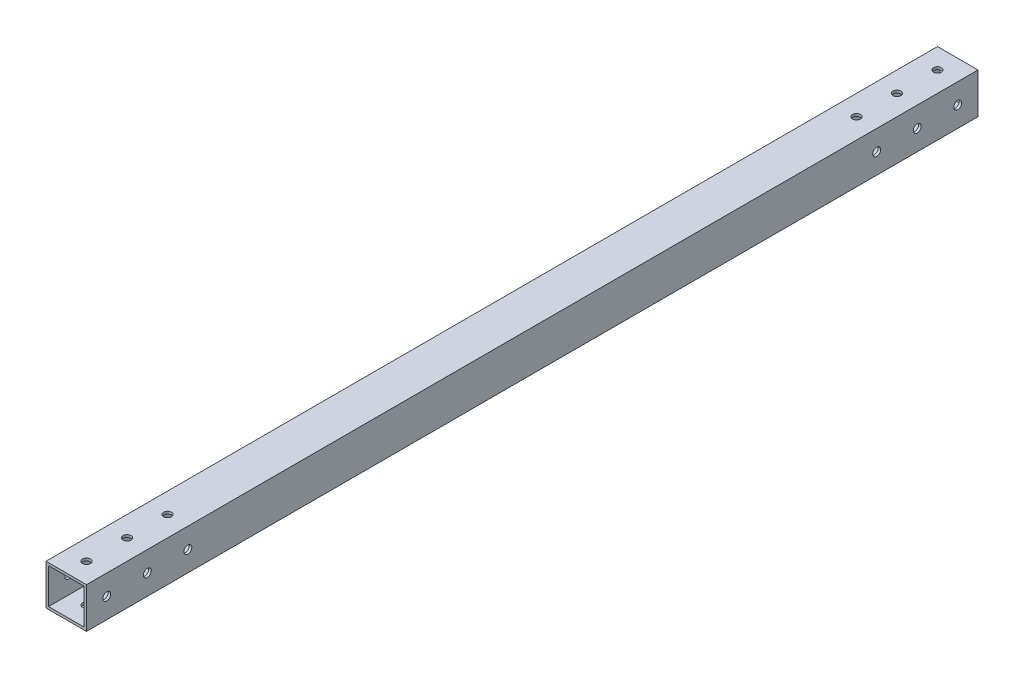
ISO-10303-21;
HEADER;
FILE_DESCRIPTION(('STEP AP214'),'2;1');
FILE_NAME('part.step','',(''),(''),'','','');
FILE_SCHEMA(('AUTOMOTIVE_DESIGN { 1 0 10303 214 1 1 1 1 }'));
ENDSEC;
DATA;
#1=APPLICATION_CONTEXT('core data for automotive mechanical design processes');
#2=APPLICATION_PROTOCOL_DEFINITION('international standard','automotive_design',2000,#1);
#3=PRODUCT_CONTEXT('',#1,'mechanical');
#4=PRODUCT('Part','Part','',(#3));
#5=PRODUCT_RELATED_PRODUCT_CATEGORY('part','',(#4));
#6=PRODUCT_DEFINITION_FORMATION('','',#4);
#7=PRODUCT_DEFINITION_CONTEXT('part definition',#1,'design');
#8=PRODUCT_DEFINITION('design','',#6,#7);
#9=PRODUCT_DEFINITION_SHAPE('','',#8);
#10=(LENGTH_UNIT() NAMED_UNIT(*) SI_UNIT(.MILLI.,.METRE.));
#11=(NAMED_UNIT(*) PLANE_ANGLE_UNIT() SI_UNIT($,.RADIAN.));
#12=(NAMED_UNIT(*) SI_UNIT($,.STERADIAN.) SOLID_ANGLE_UNIT());
#13=UNCERTAINTY_MEASURE_WITH_UNIT(LENGTH_MEASURE(1.E-05),#10,'distance_accuracy_value','');
#14=(GEOMETRIC_REPRESENTATION_CONTEXT(3) GLOBAL_UNCERTAINTY_ASSIGNED_CONTEXT((#13)) GLOBAL_UNIT_ASSIGNED_CONTEXT((#10,
#11,#12)) REPRESENTATION_CONTEXT('',''));
#15=CARTESIAN_POINT('',(0.,0.,0.));
#16=DIRECTION('',(0.,0.,1.));
#17=DIRECTION('',(1.,0.,0.));
#18=AXIS2_PLACEMENT_3D('',#15,#16,#17);
#19=CARTESIAN_POINT('',(0.,0.,279.4));
#20=DIRECTION('',(0.,0.,-1.));
#21=DIRECTION('',(-1.,0.,0.));
#22=AXIS2_PLACEMENT_3D('',#19,#20,#21);
#23=PLANE('',#22);
#24=DIRECTION('',(0.,-1.,0.));
#25=VECTOR('',#24,1.);
#26=CARTESIAN_POINT('',(0.,0.,279.4));
#27=LINE('',#26,#25);
#28=CARTESIAN_POINT('',(0.,25.4,279.4));
#29=VERTEX_POINT('',#28);
#30=CARTESIAN_POINT('',(0.,0.,279.4));
#31=VERTEX_POINT('',#30);
#32=EDGE_CURVE('E152',#29,#31,#27,.T.);
#33=ORIENTED_EDGE('',*,*,#32,.T.);
#34=DIRECTION('',(1.,0.,0.));
#35=VECTOR('',#34,1.);
#36=CARTESIAN_POINT('',(0.,0.,279.4));
#37=LINE('',#36,#35);
#38=CARTESIAN_POINT('',(25.4,0.,279.4));
#39=VERTEX_POINT('',#38);
#40=EDGE_CURVE('E156',#31,#39,#37,.T.);
#41=ORIENTED_EDGE('',*,*,#40,.T.);
#42=DIRECTION('',(0.,1.,0.));
#43=VECTOR('',#42,1.);
#44=CARTESIAN_POINT('',(25.4,0.,279.4));
#45=LINE('',#44,#43);
#46=CARTESIAN_POINT('',(25.4,25.4,279.4));
#47=VERTEX_POINT('',#46);
#48=EDGE_CURVE('E160',#39,#47,#45,.T.);
#49=ORIENTED_EDGE('',*,*,#48,.T.);
#50=DIRECTION('',(-1.,0.,0.));
#51=VECTOR('',#50,1.);
#52=CARTESIAN_POINT('',(0.,25.4,279.4));
#53=LINE('',#52,#51);
#54=EDGE_CURVE('E163',#47,#29,#53,.T.);
#55=ORIENTED_EDGE('',*,*,#54,.T.);
#56=EDGE_LOOP('',(#33,#41,#49,#55));
#57=FACE_BOUND('',#56,.T.);
#58=DIRECTION('',(0.,-1.,0.));
#59=VECTOR('',#58,1.);
#60=CARTESIAN_POINT('',(1.5875,0.,279.4));
#61=LINE('',#60,#59);
#62=CARTESIAN_POINT('',(1.58749999999999,23.8125,279.4));
#63=VERTEX_POINT('',#62);
#64=CARTESIAN_POINT('',(1.5875,1.5875,279.4));
#65=VERTEX_POINT('',#64);
#66=EDGE_CURVE('E133',#63,#65,#61,.T.);
#67=ORIENTED_EDGE('',*,*,#66,.F.);
#68=DIRECTION('',(-1.,0.,0.));
#69=VECTOR('',#68,1.);
#70=CARTESIAN_POINT('',(0.,23.8125,279.4));
#71=LINE('',#70,#69);
#72=CARTESIAN_POINT('',(23.8125,23.8125,279.4));
#73=VERTEX_POINT('',#72);
#74=EDGE_CURVE('E114',#73,#63,#71,.T.);
#75=ORIENTED_EDGE('',*,*,#74,.F.);
#76=DIRECTION('',(0.,1.,0.));
#77=VECTOR('',#76,1.);
#78=CARTESIAN_POINT('',(23.8125,0.,279.4));
#79=LINE('',#78,#77);
#80=CARTESIAN_POINT('',(23.8125,1.5875,279.4));
#81=VERTEX_POINT('',#80);
#82=EDGE_CURVE('E147',#81,#73,#79,.T.);
#83=ORIENTED_EDGE('',*,*,#82,.F.);
#84=DIRECTION('',(1.,0.,0.));
#85=VECTOR('',#84,1.);
#86=CARTESIAN_POINT('',(0.,1.5875,279.4));
#87=LINE('',#86,#85);
#88=EDGE_CURVE('E138',#65,#81,#87,.T.);
#89=ORIENTED_EDGE('',*,*,#88,.F.);
#90=EDGE_LOOP('',(#67,#75,#83,#89));
#91=FACE_BOUND('',#90,.T.);
#92=ADVANCED_FACE('F41',(#57,#91),#23,.F.);
#93=CARTESIAN_POINT('',(0.,0.,-279.4));
#94=DIRECTION('',(0.,0.,-1.));
#95=DIRECTION('',(-1.,0.,0.));
#96=AXIS2_PLACEMENT_3D('',#93,#94,#95);
#97=PLANE('',#96);
#98=DIRECTION('',(0.,-1.,0.));
#99=VECTOR('',#98,1.);
#100=CARTESIAN_POINT('',(0.,0.,-279.4));
#101=LINE('',#100,#99);
#102=CARTESIAN_POINT('',(0.,25.4,-279.4));
#103=VERTEX_POINT('',#102);
#104=CARTESIAN_POINT('',(0.,0.,-279.4));
#105=VERTEX_POINT('',#104);
#106=EDGE_CURVE('E167',#103,#105,#101,.T.);
#107=ORIENTED_EDGE('',*,*,#106,.F.);
#108=DIRECTION('',(-1.,0.,0.));
#109=VECTOR('',#108,1.);
#110=CARTESIAN_POINT('',(0.,25.4,-279.4));
#111=LINE('',#110,#109);
#112=CARTESIAN_POINT('',(25.4,25.4,-279.4));
#113=VERTEX_POINT('',#112);
#114=EDGE_CURVE('E157',#113,#103,#111,.T.);
#115=ORIENTED_EDGE('',*,*,#114,.F.);
#116=DIRECTION('',(0.,1.,0.));
#117=VECTOR('',#116,1.);
#118=CARTESIAN_POINT('',(25.4,0.,-279.4));
#119=LINE('',#118,#117);
#120=CARTESIAN_POINT('',(25.4,0.,-279.4));
#121=VERTEX_POINT('',#120);
#122=EDGE_CURVE('E174',#121,#113,#119,.T.);
#123=ORIENTED_EDGE('',*,*,#122,.F.);
#124=DIRECTION('',(1.,0.,0.));
#125=VECTOR('',#124,1.);
#126=CARTESIAN_POINT('',(0.,0.,-279.4));
#127=LINE('',#126,#125);
#128=EDGE_CURVE('E171',#105,#121,#127,.T.);
#129=ORIENTED_EDGE('',*,*,#128,.F.);
#130=EDGE_LOOP('',(#107,#115,#123,#129));
#131=FACE_BOUND('',#130,.T.);
#132=DIRECTION('',(-1.,0.,0.));
#133=VECTOR('',#132,1.);
#134=CARTESIAN_POINT('',(0.,23.8125,-279.4));
#135=LINE('',#134,#133);
#136=CARTESIAN_POINT('',(23.8125,23.8125,-279.4));
#137=VERTEX_POINT('',#136);
#138=CARTESIAN_POINT('',(1.58749999999999,23.8125,-279.4));
#139=VERTEX_POINT('',#138);
#140=EDGE_CURVE('E112',#137,#139,#135,.T.);
#141=ORIENTED_EDGE('',*,*,#140,.T.);
#142=DIRECTION('',(0.,-1.,0.));
#143=VECTOR('',#142,1.);
#144=CARTESIAN_POINT('',(1.5875,0.,-279.4));
#145=LINE('',#144,#143);
#146=CARTESIAN_POINT('',(1.5875,1.5875,-279.4));
#147=VERTEX_POINT('',#146);
#148=EDGE_CURVE('E121',#139,#147,#145,.T.);
#149=ORIENTED_EDGE('',*,*,#148,.T.);
#150=DIRECTION('',(1.,0.,0.));
#151=VECTOR('',#150,1.);
#152=CARTESIAN_POINT('',(0.,1.5875,-279.4));
#153=LINE('',#152,#151);
#154=CARTESIAN_POINT('',(23.8125,1.5875,-279.4));
#155=VERTEX_POINT('',#154);
#156=EDGE_CURVE('E128',#147,#155,#153,.T.);
#157=ORIENTED_EDGE('',*,*,#156,.T.);
#158=DIRECTION('',(0.,1.,0.));
#159=VECTOR('',#158,1.);
#160=CARTESIAN_POINT('',(23.8125,0.,-279.4));
#161=LINE('',#160,#159);
#162=EDGE_CURVE('E66',#155,#137,#161,.T.);
#163=ORIENTED_EDGE('',*,*,#162,.T.);
#164=EDGE_LOOP('',(#141,#149,#157,#163));
#165=FACE_BOUND('',#164,.T.);
#166=ADVANCED_FACE('F131',(#131,#165),#97,.T.);
#167=CARTESIAN_POINT('',(0.,0.,279.4));
#168=DIRECTION('',(1.,0.,0.));
#169=DIRECTION('',(0.,1.,0.));
#170=AXIS2_PLACEMENT_3D('',#167,#168,#169);
#171=PLANE('',#170);
#172=CARTESIAN_POINT('',(0.,12.7,-266.7));
#173=DIRECTION('',(1.,0.,0.));
#174=DIRECTION('',(0.,-1.,0.));
#175=AXIS2_PLACEMENT_3D('',#172,#173,#174);
#176=CIRCLE('',#175,2.48920000000001);
#177=CARTESIAN_POINT('',(0.,10.2108,-266.7));
#178=VERTEX_POINT('',#177);
#179=EDGE_CURVE('E850',#178,#178,#176,.T.);
#180=ORIENTED_EDGE('',*,*,#179,.T.);
#181=EDGE_LOOP('',(#180));
#182=FACE_BOUND('',#181,.T.);
#183=CARTESIAN_POINT('',(0.,12.7,-241.3));
#184=DIRECTION('',(1.,0.,0.));
#185=DIRECTION('',(0.,-1.,0.));
#186=AXIS2_PLACEMENT_3D('',#183,#184,#185);
#187=CIRCLE('',#186,2.4892);
#188=CARTESIAN_POINT('',(0.,10.2108,-241.3));
#189=VERTEX_POINT('',#188);
#190=EDGE_CURVE('E860',#189,#189,#187,.T.);
#191=ORIENTED_EDGE('',*,*,#190,.T.);
#192=EDGE_LOOP('',(#191));
#193=FACE_BOUND('',#192,.T.);
#194=CARTESIAN_POINT('',(0.,12.7,-215.9));
#195=DIRECTION('',(1.,0.,0.));
#196=DIRECTION('',(0.,-1.,0.));
#197=AXIS2_PLACEMENT_3D('',#194,#195,#196);
#198=CIRCLE('',#197,2.4892);
#199=CARTESIAN_POINT('',(0.,10.2108,-215.9));
#200=VERTEX_POINT('',#199);
#201=EDGE_CURVE('E258',#200,#200,#198,.T.);
#202=ORIENTED_EDGE('',*,*,#201,.T.);
#203=EDGE_LOOP('',(#202));
#204=FACE_BOUND('',#203,.T.);
#205=CARTESIAN_POINT('',(0.,12.7,266.7));
#206=DIRECTION('',(-1.,0.,0.));
#207=DIRECTION('',(0.,-1.,0.));
#208=AXIS2_PLACEMENT_3D('',#205,#206,#207);
#209=CIRCLE('',#208,2.48920000000001);
#210=CARTESIAN_POINT('',(0.,10.2108,266.7));
#211=VERTEX_POINT('',#210);
#212=EDGE_CURVE('E301',#211,#211,#209,.T.);
#213=ORIENTED_EDGE('',*,*,#212,.F.);
#214=EDGE_LOOP('',(#213));
#215=FACE_BOUND('',#214,.T.);
#216=CARTESIAN_POINT('',(0.,12.7,241.3));
#217=DIRECTION('',(-1.,0.,0.));
#218=DIRECTION('',(0.,-1.,0.));
#219=AXIS2_PLACEMENT_3D('',#216,#217,#218);
#220=CIRCLE('',#219,2.4892);
#221=CARTESIAN_POINT('',(0.,10.2108,241.3));
#222=VERTEX_POINT('',#221);
#223=EDGE_CURVE('E309',#222,#222,#220,.T.);
#224=ORIENTED_EDGE('',*,*,#223,.F.);
#225=EDGE_LOOP('',(#224));
#226=FACE_BOUND('',#225,.T.);
#227=CARTESIAN_POINT('',(0.,12.7,215.9));
#228=DIRECTION('',(-1.,0.,0.));
#229=DIRECTION('',(0.,-1.,0.));
#230=AXIS2_PLACEMENT_3D('',#227,#228,#229);
#231=CIRCLE('',#230,2.4892);
#232=CARTESIAN_POINT('',(0.,10.2108,215.9));
#233=VERTEX_POINT('',#232);
#234=EDGE_CURVE('E297',#233,#233,#231,.T.);
#235=ORIENTED_EDGE('',*,*,#234,.F.);
#236=EDGE_LOOP('',(#235));
#237=FACE_BOUND('',#236,.T.);
#238=ORIENTED_EDGE('',*,*,#106,.T.);
#239=DIRECTION('',(0.,0.,-1.));
#240=VECTOR('',#239,1.);
#241=CARTESIAN_POINT('',(0.,0.,279.4));
#242=LINE('',#241,#240);
#243=EDGE_CURVE('E11',#31,#105,#242,.T.);
#244=ORIENTED_EDGE('',*,*,#243,.F.);
#245=ORIENTED_EDGE('',*,*,#32,.F.);
#246=DIRECTION('',(0.,0.,-1.));
#247=VECTOR('',#246,1.);
#248=CARTESIAN_POINT('',(0.,25.4,279.4));
#249=LINE('',#248,#247);
#250=EDGE_CURVE('E166',#29,#103,#249,.T.);
#251=ORIENTED_EDGE('',*,*,#250,.T.);
#252=EDGE_LOOP('',(#238,#244,#245,#251));
#253=FACE_BOUND('',#252,.T.);
#254=ADVANCED_FACE('F43',(#182,#193,#204,#215,#226,#237,#253),#171,.F.);
#255=CARTESIAN_POINT('',(0.,0.,279.4));
#256=DIRECTION('',(0.,1.,0.));
#257=DIRECTION('',(0.,0.,1.));
#258=AXIS2_PLACEMENT_3D('',#255,#256,#257);
#259=PLANE('',#258);
#260=CARTESIAN_POINT('',(12.7,0.,-266.7));
#261=DIRECTION('',(0.,-1.,0.));
#262=DIRECTION('',(0.,0.,-1.));
#263=AXIS2_PLACEMENT_3D('',#260,#261,#262);
#264=CIRCLE('',#263,2.48920000000001);
#265=CARTESIAN_POINT('',(12.7,0.,-269.1892));
#266=VERTEX_POINT('',#265);
#267=EDGE_CURVE('E225',#266,#266,#264,.T.);
#268=ORIENTED_EDGE('',*,*,#267,.F.);
#269=EDGE_LOOP('',(#268));
#270=FACE_BOUND('',#269,.T.);
#271=CARTESIAN_POINT('',(12.7,0.,-241.3));
#272=DIRECTION('',(0.,-1.,0.));
#273=DIRECTION('',(0.,0.,-1.));
#274=AXIS2_PLACEMENT_3D('',#271,#272,#273);
#275=CIRCLE('',#274,2.48920000000001);
#276=CARTESIAN_POINT('',(12.7,0.,-243.7892));
#277=VERTEX_POINT('',#276);
#278=EDGE_CURVE('E273',#277,#277,#275,.T.);
#279=ORIENTED_EDGE('',*,*,#278,.F.);
#280=EDGE_LOOP('',(#279));
#281=FACE_BOUND('',#280,.T.);
#282=CARTESIAN_POINT('',(12.7,0.,-215.9));
#283=DIRECTION('',(0.,-1.,0.));
#284=DIRECTION('',(0.,0.,-1.));
#285=AXIS2_PLACEMENT_3D('',#282,#283,#284);
#286=CIRCLE('',#285,2.48920000000001);
#287=CARTESIAN_POINT('',(12.7,0.,-218.3892));
#288=VERTEX_POINT('',#287);
#289=EDGE_CURVE('E281',#288,#288,#286,.T.);
#290=ORIENTED_EDGE('',*,*,#289,.F.);
#291=EDGE_LOOP('',(#290));
#292=FACE_BOUND('',#291,.T.);
#293=CARTESIAN_POINT('',(12.7,0.,266.7));
#294=DIRECTION('',(0.,1.,0.));
#295=DIRECTION('',(0.,0.,1.));
#296=AXIS2_PLACEMENT_3D('',#293,#294,#295);
#297=CIRCLE('',#296,2.48920000000001);
#298=CARTESIAN_POINT('',(12.7,0.,269.1892));
#299=VERTEX_POINT('',#298);
#300=EDGE_CURVE('E194',#299,#299,#297,.T.);
#301=ORIENTED_EDGE('',*,*,#300,.T.);
#302=EDGE_LOOP('',(#301));
#303=FACE_BOUND('',#302,.T.);
#304=CARTESIAN_POINT('',(12.7,0.,241.3));
#305=DIRECTION('',(0.,1.,0.));
#306=DIRECTION('',(0.,0.,1.));
#307=AXIS2_PLACEMENT_3D('',#304,#305,#306);
#308=CIRCLE('',#307,2.48920000000001);
#309=CARTESIAN_POINT('',(12.7,0.,243.7892));
#310=VERTEX_POINT('',#309);
#311=EDGE_CURVE('E337',#310,#310,#308,.T.);
#312=ORIENTED_EDGE('',*,*,#311,.T.);
#313=EDGE_LOOP('',(#312));
#314=FACE_BOUND('',#313,.T.);
#315=CARTESIAN_POINT('',(12.7,0.,215.9));
#316=DIRECTION('',(0.,1.,0.));
#317=DIRECTION('',(0.,0.,1.));
#318=AXIS2_PLACEMENT_3D('',#315,#316,#317);
#319=CIRCLE('',#318,2.48920000000001);
#320=CARTESIAN_POINT('',(12.7,0.,218.3892));
#321=VERTEX_POINT('',#320);
#322=EDGE_CURVE('E345',#321,#321,#319,.T.);
#323=ORIENTED_EDGE('',*,*,#322,.T.);
#324=EDGE_LOOP('',(#323));
#325=FACE_BOUND('',#324,.T.);
#326=ORIENTED_EDGE('',*,*,#128,.T.);
#327=DIRECTION('',(0.,0.,-1.));
#328=VECTOR('',#327,1.);
#329=CARTESIAN_POINT('',(25.4,0.,279.4));
#330=LINE('',#329,#328);
#331=EDGE_CURVE('E51',#39,#121,#330,.T.);
#332=ORIENTED_EDGE('',*,*,#331,.F.);
#333=ORIENTED_EDGE('',*,*,#40,.F.);
#334=ORIENTED_EDGE('',*,*,#243,.T.);
#335=EDGE_LOOP('',(#326,#332,#333,#334));
#336=FACE_BOUND('',#335,.T.);
#337=ADVANCED_FACE('F401',(#270,#281,#292,#303,#314,#325,#336),#259,.F.);
#338=CARTESIAN_POINT('',(25.4,0.,279.4));
#339=DIRECTION('',(-1.,0.,0.));
#340=DIRECTION('',(0.,-1.,0.));
#341=AXIS2_PLACEMENT_3D('',#338,#339,#340);
#342=PLANE('',#341);
#343=CARTESIAN_POINT('',(25.4,12.7,-266.7));
#344=DIRECTION('',(1.,0.,0.));
#345=DIRECTION('',(0.,-1.,0.));
#346=AXIS2_PLACEMENT_3D('',#343,#344,#345);
#347=CIRCLE('',#346,2.48920000000001);
#348=CARTESIAN_POINT('',(25.4,10.2108,-266.7));
#349=VERTEX_POINT('',#348);
#350=EDGE_CURVE('E240',#349,#349,#347,.T.);
#351=ORIENTED_EDGE('',*,*,#350,.F.);
#352=EDGE_LOOP('',(#351));
#353=FACE_BOUND('',#352,.T.);
#354=CARTESIAN_POINT('',(25.4,12.7,-241.3));
#355=DIRECTION('',(1.,0.,0.));
#356=DIRECTION('',(0.,-1.,0.));
#357=AXIS2_PLACEMENT_3D('',#354,#355,#356);
#358=CIRCLE('',#357,2.4892);
#359=CARTESIAN_POINT('',(25.4,10.2108,-241.3));
#360=VERTEX_POINT('',#359);
#361=EDGE_CURVE('E852',#360,#360,#358,.T.);
#362=ORIENTED_EDGE('',*,*,#361,.F.);
#363=EDGE_LOOP('',(#362));
#364=FACE_BOUND('',#363,.T.);
#365=CARTESIAN_POINT('',(25.4,12.7,-215.9));
#366=DIRECTION('',(1.,0.,0.));
#367=DIRECTION('',(0.,-1.,0.));
#368=AXIS2_PLACEMENT_3D('',#365,#366,#367);
#369=CIRCLE('',#368,2.4892);
#370=CARTESIAN_POINT('',(25.4,10.2108,-215.9));
#371=VERTEX_POINT('',#370);
#372=EDGE_CURVE('E865',#371,#371,#369,.T.);
#373=ORIENTED_EDGE('',*,*,#372,.F.);
#374=EDGE_LOOP('',(#373));
#375=FACE_BOUND('',#374,.T.);
#376=CARTESIAN_POINT('',(25.4,12.7,266.7));
#377=DIRECTION('',(-1.,0.,0.));
#378=DIRECTION('',(0.,-1.,0.));
#379=AXIS2_PLACEMENT_3D('',#376,#377,#378);
#380=CIRCLE('',#379,2.48920000000001);
#381=CARTESIAN_POINT('',(25.4,10.2108,266.7));
#382=VERTEX_POINT('',#381);
#383=EDGE_CURVE('E209',#382,#382,#380,.T.);
#384=ORIENTED_EDGE('',*,*,#383,.T.);
#385=EDGE_LOOP('',(#384));
#386=FACE_BOUND('',#385,.T.);
#387=CARTESIAN_POINT('',(25.4,12.7,241.3));
#388=DIRECTION('',(-1.,0.,0.));
#389=DIRECTION('',(0.,-1.,0.));
#390=AXIS2_PLACEMENT_3D('',#387,#388,#389);
#391=CIRCLE('',#390,2.4892);
#392=CARTESIAN_POINT('',(25.4,10.2108,241.3));
#393=VERTEX_POINT('',#392);
#394=EDGE_CURVE('E305',#393,#393,#391,.T.);
#395=ORIENTED_EDGE('',*,*,#394,.T.);
#396=EDGE_LOOP('',(#395));
#397=FACE_BOUND('',#396,.T.);
#398=CARTESIAN_POINT('',(25.4,12.7,215.9));
#399=DIRECTION('',(-1.,0.,0.));
#400=DIRECTION('',(0.,-1.,0.));
#401=AXIS2_PLACEMENT_3D('',#398,#399,#400);
#402=CIRCLE('',#401,2.4892);
#403=CARTESIAN_POINT('',(25.4,10.2108,215.9));
#404=VERTEX_POINT('',#403);
#405=EDGE_CURVE('E313',#404,#404,#402,.T.);
#406=ORIENTED_EDGE('',*,*,#405,.T.);
#407=EDGE_LOOP('',(#406));
#408=FACE_BOUND('',#407,.T.);
#409=ORIENTED_EDGE('',*,*,#122,.T.);
#410=DIRECTION('',(0.,0.,-1.));
#411=VECTOR('',#410,1.);
#412=CARTESIAN_POINT('',(25.4,25.4,279.4));
#413=LINE('',#412,#411);
#414=EDGE_CURVE('E182',#47,#113,#413,.T.);
#415=ORIENTED_EDGE('',*,*,#414,.F.);
#416=ORIENTED_EDGE('',*,*,#48,.F.);
#417=ORIENTED_EDGE('',*,*,#331,.T.);
#418=EDGE_LOOP('',(#409,#415,#416,#417));
#419=FACE_BOUND('',#418,.T.);
#420=ADVANCED_FACE('F398',(#353,#364,#375,#386,#397,#408,#419),#342,.F.);
#421=CARTESIAN_POINT('',(0.,25.4,279.4));
#422=DIRECTION('',(0.,-1.,0.));
#423=DIRECTION('',(0.,0.,-1.));
#424=AXIS2_PLACEMENT_3D('',#421,#422,#423);
#425=PLANE('',#424);
#426=CARTESIAN_POINT('',(12.7,25.4,-266.7));
#427=DIRECTION('',(0.,-1.,0.));
#428=DIRECTION('',(0.,0.,-1.));
#429=AXIS2_PLACEMENT_3D('',#426,#427,#428);
#430=CIRCLE('',#429,2.48920000000001);
#431=CARTESIAN_POINT('',(12.7,25.4,-269.1892));
#432=VERTEX_POINT('',#431);
#433=EDGE_CURVE('E269',#432,#432,#430,.T.);
#434=ORIENTED_EDGE('',*,*,#433,.T.);
#435=EDGE_LOOP('',(#434));
#436=FACE_BOUND('',#435,.T.);
#437=CARTESIAN_POINT('',(12.7,25.4,-241.3));
#438=DIRECTION('',(0.,-1.,0.));
#439=DIRECTION('',(0.,0.,-1.));
#440=AXIS2_PLACEMENT_3D('',#437,#438,#439);
#441=CIRCLE('',#440,2.48920000000001);
#442=CARTESIAN_POINT('',(12.7,25.4,-243.7892));
#443=VERTEX_POINT('',#442);
#444=EDGE_CURVE('E277',#443,#443,#441,.T.);
#445=ORIENTED_EDGE('',*,*,#444,.T.);
#446=EDGE_LOOP('',(#445));
#447=FACE_BOUND('',#446,.T.);
#448=CARTESIAN_POINT('',(12.7,25.4,-215.9));
#449=DIRECTION('',(0.,-1.,0.));
#450=DIRECTION('',(0.,0.,-1.));
#451=AXIS2_PLACEMENT_3D('',#448,#449,#450);
#452=CIRCLE('',#451,2.48920000000001);
#453=CARTESIAN_POINT('',(12.7,25.4,-218.3892));
#454=VERTEX_POINT('',#453);
#455=EDGE_CURVE('E265',#454,#454,#452,.T.);
#456=ORIENTED_EDGE('',*,*,#455,.T.);
#457=EDGE_LOOP('',(#456));
#458=FACE_BOUND('',#457,.T.);
#459=CARTESIAN_POINT('',(12.7,25.4,266.7));
#460=DIRECTION('',(0.,1.,0.));
#461=DIRECTION('',(0.,0.,1.));
#462=AXIS2_PLACEMENT_3D('',#459,#460,#461);
#463=CIRCLE('',#462,2.48920000000001);
#464=CARTESIAN_POINT('',(12.7,25.4,269.1892));
#465=VERTEX_POINT('',#464);
#466=EDGE_CURVE('E333',#465,#465,#463,.T.);
#467=ORIENTED_EDGE('',*,*,#466,.F.);
#468=EDGE_LOOP('',(#467));
#469=FACE_BOUND('',#468,.T.);
#470=CARTESIAN_POINT('',(12.7,25.4,241.3));
#471=DIRECTION('',(0.,1.,0.));
#472=DIRECTION('',(0.,0.,1.));
#473=AXIS2_PLACEMENT_3D('',#470,#471,#472);
#474=CIRCLE('',#473,2.48920000000001);
#475=CARTESIAN_POINT('',(12.7,25.4,243.7892));
#476=VERTEX_POINT('',#475);
#477=EDGE_CURVE('E341',#476,#476,#474,.T.);
#478=ORIENTED_EDGE('',*,*,#477,.F.);
#479=EDGE_LOOP('',(#478));
#480=FACE_BOUND('',#479,.T.);
#481=CARTESIAN_POINT('',(12.7,25.4,215.9));
#482=DIRECTION('',(0.,1.,0.));
#483=DIRECTION('',(0.,0.,1.));
#484=AXIS2_PLACEMENT_3D('',#481,#482,#483);
#485=CIRCLE('',#484,2.48920000000001);
#486=CARTESIAN_POINT('',(12.7,25.4,218.3892));
#487=VERTEX_POINT('',#486);
#488=EDGE_CURVE('E329',#487,#487,#485,.T.);
#489=ORIENTED_EDGE('',*,*,#488,.F.);
#490=EDGE_LOOP('',(#489));
#491=FACE_BOUND('',#490,.T.);
#492=ORIENTED_EDGE('',*,*,#114,.T.);
#493=ORIENTED_EDGE('',*,*,#250,.F.);
#494=ORIENTED_EDGE('',*,*,#54,.F.);
#495=ORIENTED_EDGE('',*,*,#414,.T.);
#496=EDGE_LOOP('',(#492,#493,#494,#495));
#497=FACE_BOUND('',#496,.T.);
#498=ADVANCED_FACE('F382',(#436,#447,#458,#469,#480,#491,#497),#425,.F.);
#499=CARTESIAN_POINT('',(1.5875,0.,279.4));
#500=DIRECTION('',(1.,0.,0.));
#501=DIRECTION('',(0.,1.,0.));
#502=AXIS2_PLACEMENT_3D('',#499,#500,#501);
#503=PLANE('',#502);
#504=CARTESIAN_POINT('',(1.5875,12.7,-266.7));
#505=DIRECTION('',(1.,0.,0.));
#506=DIRECTION('',(0.,1.,0.));
#507=AXIS2_PLACEMENT_3D('',#504,#505,#506);
#508=CIRCLE('',#507,2.48920000000001);
#509=CARTESIAN_POINT('',(1.58749999999999,15.1892,-266.7));
#510=VERTEX_POINT('',#509);
#511=EDGE_CURVE('E261',#510,#510,#508,.F.);
#512=ORIENTED_EDGE('',*,*,#511,.T.);
#513=EDGE_LOOP('',(#512));
#514=FACE_BOUND('',#513,.T.);
#515=CARTESIAN_POINT('',(1.5875,12.7,-241.3));
#516=DIRECTION('',(1.,0.,0.));
#517=DIRECTION('',(0.,1.,0.));
#518=AXIS2_PLACEMENT_3D('',#515,#516,#517);
#519=CIRCLE('',#518,2.4892);
#520=CARTESIAN_POINT('',(1.58749999999999,15.1892,-241.3));
#521=VERTEX_POINT('',#520);
#522=EDGE_CURVE('E244',#521,#521,#519,.F.);
#523=ORIENTED_EDGE('',*,*,#522,.T.);
#524=EDGE_LOOP('',(#523));
#525=FACE_BOUND('',#524,.T.);
#526=CARTESIAN_POINT('',(1.5875,12.7,-215.9));
#527=DIRECTION('',(1.,0.,0.));
#528=DIRECTION('',(0.,1.,0.));
#529=AXIS2_PLACEMENT_3D('',#526,#527,#528);
#530=CIRCLE('',#529,2.4892);
#531=CARTESIAN_POINT('',(1.58749999999999,15.1892,-215.9));
#532=VERTEX_POINT('',#531);
#533=EDGE_CURVE('E239',#532,#532,#530,.F.);
#534=ORIENTED_EDGE('',*,*,#533,.T.);
#535=EDGE_LOOP('',(#534));
#536=FACE_BOUND('',#535,.T.);
#537=CARTESIAN_POINT('',(1.5875,12.7,266.7));
#538=DIRECTION('',(1.,0.,0.));
#539=DIRECTION('',(0.,1.,0.));
#540=AXIS2_PLACEMENT_3D('',#537,#538,#539);
#541=CIRCLE('',#540,2.48920000000001);
#542=CARTESIAN_POINT('',(1.58749999999999,15.1892,266.7));
#543=VERTEX_POINT('',#542);
#544=EDGE_CURVE('E219',#543,#543,#541,.T.);
#545=ORIENTED_EDGE('',*,*,#544,.F.);
#546=EDGE_LOOP('',(#545));
#547=FACE_BOUND('',#546,.T.);
#548=CARTESIAN_POINT('',(1.5875,12.7,241.3));
#549=DIRECTION('',(1.,0.,0.));
#550=DIRECTION('',(0.,1.,0.));
#551=AXIS2_PLACEMENT_3D('',#548,#549,#550);
#552=CIRCLE('',#551,2.4892);
#553=CARTESIAN_POINT('',(1.58749999999999,15.1892,241.3));
#554=VERTEX_POINT('',#553);
#555=EDGE_CURVE('E214',#554,#554,#552,.T.);
#556=ORIENTED_EDGE('',*,*,#555,.F.);
#557=EDGE_LOOP('',(#556));
#558=FACE_BOUND('',#557,.T.);
#559=CARTESIAN_POINT('',(1.5875,12.7,215.9));
#560=DIRECTION('',(1.,0.,0.));
#561=DIRECTION('',(0.,1.,0.));
#562=AXIS2_PLACEMENT_3D('',#559,#560,#561);
#563=CIRCLE('',#562,2.4892);
#564=CARTESIAN_POINT('',(1.58749999999999,15.1892,215.9));
#565=VERTEX_POINT('',#564);
#566=EDGE_CURVE('E208',#565,#565,#563,.T.);
#567=ORIENTED_EDGE('',*,*,#566,.F.);
#568=EDGE_LOOP('',(#567));
#569=FACE_BOUND('',#568,.T.);
#570=ORIENTED_EDGE('',*,*,#148,.F.);
#571=DIRECTION('',(0.,0.,-1.));
#572=VECTOR('',#571,1.);
#573=CARTESIAN_POINT('',(1.58749999999999,23.8125,279.4));
#574=LINE('',#573,#572);
#575=EDGE_CURVE('E108',#63,#139,#574,.T.);
#576=ORIENTED_EDGE('',*,*,#575,.F.);
#577=ORIENTED_EDGE('',*,*,#66,.T.);
#578=DIRECTION('',(0.,0.,-1.));
#579=VECTOR('',#578,1.);
#580=CARTESIAN_POINT('',(1.5875,1.5875,279.4));
#581=LINE('',#580,#579);
#582=EDGE_CURVE('E124',#65,#147,#581,.T.);
#583=ORIENTED_EDGE('',*,*,#582,.T.);
#584=EDGE_LOOP('',(#570,#576,#577,#583));
#585=FACE_BOUND('',#584,.T.);
#586=ADVANCED_FACE('F122',(#514,#525,#536,#547,#558,#569,#585),#503,.T.);
#587=CARTESIAN_POINT('',(0.,1.5875,279.4));
#588=DIRECTION('',(0.,1.,0.));
#589=DIRECTION('',(0.,0.,1.));
#590=AXIS2_PLACEMENT_3D('',#587,#588,#589);
#591=PLANE('',#590);
#592=CARTESIAN_POINT('',(12.7,1.5875,-266.7));
#593=DIRECTION('',(0.,1.,0.));
#594=DIRECTION('',(0.,0.,1.));
#595=AXIS2_PLACEMENT_3D('',#592,#593,#594);
#596=CIRCLE('',#595,2.48920000000001);
#597=CARTESIAN_POINT('',(12.7,1.5875,-264.2108));
#598=VERTEX_POINT('',#597);
#599=EDGE_CURVE('E235',#598,#598,#596,.F.);
#600=ORIENTED_EDGE('',*,*,#599,.T.);
#601=EDGE_LOOP('',(#600));
#602=FACE_BOUND('',#601,.T.);
#603=CARTESIAN_POINT('',(12.7,1.5875,-241.3));
#604=DIRECTION('',(0.,1.,0.));
#605=DIRECTION('',(0.,0.,1.));
#606=AXIS2_PLACEMENT_3D('',#603,#604,#605);
#607=CIRCLE('',#606,2.48920000000001);
#608=CARTESIAN_POINT('',(12.7,1.5875,-238.8108));
#609=VERTEX_POINT('',#608);
#610=EDGE_CURVE('E230',#609,#609,#607,.F.);
#611=ORIENTED_EDGE('',*,*,#610,.T.);
#612=EDGE_LOOP('',(#611));
#613=FACE_BOUND('',#612,.T.);
#614=CARTESIAN_POINT('',(12.7,1.5875,-215.9));
#615=DIRECTION('',(0.,1.,0.));
#616=DIRECTION('',(0.,0.,1.));
#617=AXIS2_PLACEMENT_3D('',#614,#615,#616);
#618=CIRCLE('',#617,2.48920000000001);
#619=CARTESIAN_POINT('',(12.7,1.5875,-213.4108));
#620=VERTEX_POINT('',#619);
#621=EDGE_CURVE('E224',#620,#620,#618,.F.);
#622=ORIENTED_EDGE('',*,*,#621,.T.);
#623=EDGE_LOOP('',(#622));
#624=FACE_BOUND('',#623,.T.);
#625=CARTESIAN_POINT('',(12.7,1.5875,266.7));
#626=DIRECTION('',(0.,1.,0.));
#627=DIRECTION('',(0.,0.,1.));
#628=AXIS2_PLACEMENT_3D('',#625,#626,#627);
#629=CIRCLE('',#628,2.48920000000001);
#630=CARTESIAN_POINT('',(12.7,1.5875,269.1892));
#631=VERTEX_POINT('',#630);
#632=EDGE_CURVE('E129',#631,#631,#629,.T.);
#633=ORIENTED_EDGE('',*,*,#632,.F.);
#634=EDGE_LOOP('',(#633));
#635=FACE_BOUND('',#634,.T.);
#636=CARTESIAN_POINT('',(12.7,1.5875,241.3));
#637=DIRECTION('',(0.,1.,0.));
#638=DIRECTION('',(0.,0.,1.));
#639=AXIS2_PLACEMENT_3D('',#636,#637,#638);
#640=CIRCLE('',#639,2.48920000000001);
#641=CARTESIAN_POINT('',(12.7,1.5875,243.7892));
#642=VERTEX_POINT('',#641);
#643=EDGE_CURVE('E199',#642,#642,#640,.T.);
#644=ORIENTED_EDGE('',*,*,#643,.F.);
#645=EDGE_LOOP('',(#644));
#646=FACE_BOUND('',#645,.T.);
#647=CARTESIAN_POINT('',(12.7,1.5875,215.9));
#648=DIRECTION('',(0.,1.,0.));
#649=DIRECTION('',(0.,0.,1.));
#650=AXIS2_PLACEMENT_3D('',#647,#648,#649);
#651=CIRCLE('',#650,2.48920000000001);
#652=CARTESIAN_POINT('',(12.7,1.5875,218.3892));
#653=VERTEX_POINT('',#652);
#654=EDGE_CURVE('E193',#653,#653,#651,.T.);
#655=ORIENTED_EDGE('',*,*,#654,.F.);
#656=EDGE_LOOP('',(#655));
#657=FACE_BOUND('',#656,.T.);
#658=ORIENTED_EDGE('',*,*,#156,.F.);
#659=ORIENTED_EDGE('',*,*,#582,.F.);
#660=ORIENTED_EDGE('',*,*,#88,.T.);
#661=DIRECTION('',(0.,0.,-1.));
#662=VECTOR('',#661,1.);
#663=CARTESIAN_POINT('',(23.8125,1.5875,279.4));
#664=LINE('',#663,#662);
#665=EDGE_CURVE('E362',#81,#155,#664,.T.);
#666=ORIENTED_EDGE('',*,*,#665,.T.);
#667=EDGE_LOOP('',(#658,#659,#660,#666));
#668=FACE_BOUND('',#667,.T.);
#669=ADVANCED_FACE('F372',(#602,#613,#624,#635,#646,#657,#668),#591,.T.);
#670=CARTESIAN_POINT('',(23.8125,0.,279.4));
#671=DIRECTION('',(-1.,0.,0.));
#672=DIRECTION('',(0.,-1.,0.));
#673=AXIS2_PLACEMENT_3D('',#670,#671,#672);
#674=PLANE('',#673);
#675=CARTESIAN_POINT('',(23.8125,12.7,-266.7));
#676=DIRECTION('',(-1.,0.,0.));
#677=DIRECTION('',(0.,-1.,0.));
#678=AXIS2_PLACEMENT_3D('',#675,#676,#677);
#679=CIRCLE('',#678,2.48920000000001);
#680=CARTESIAN_POINT('',(23.8125,10.2108,-266.7));
#681=VERTEX_POINT('',#680);
#682=EDGE_CURVE('E45',#681,#681,#679,.F.);
#683=ORIENTED_EDGE('',*,*,#682,.T.);
#684=EDGE_LOOP('',(#683));
#685=FACE_BOUND('',#684,.T.);
#686=CARTESIAN_POINT('',(23.8125,12.7,-241.3));
#687=DIRECTION('',(-1.,0.,0.));
#688=DIRECTION('',(0.,-1.,0.));
#689=AXIS2_PLACEMENT_3D('',#686,#687,#688);
#690=CIRCLE('',#689,2.4892);
#691=CARTESIAN_POINT('',(23.8125,10.2108,-241.3));
#692=VERTEX_POINT('',#691);
#693=EDGE_CURVE('E241',#692,#692,#690,.F.);
#694=ORIENTED_EDGE('',*,*,#693,.T.);
#695=EDGE_LOOP('',(#694));
#696=FACE_BOUND('',#695,.T.);
#697=CARTESIAN_POINT('',(23.8125,12.7,-215.9));
#698=DIRECTION('',(-1.,0.,0.));
#699=DIRECTION('',(0.,-1.,0.));
#700=AXIS2_PLACEMENT_3D('',#697,#698,#699);
#701=CIRCLE('',#700,2.4892);
#702=CARTESIAN_POINT('',(23.8125,10.2108,-215.9));
#703=VERTEX_POINT('',#702);
#704=EDGE_CURVE('E236',#703,#703,#701,.F.);
#705=ORIENTED_EDGE('',*,*,#704,.T.);
#706=EDGE_LOOP('',(#705));
#707=FACE_BOUND('',#706,.T.);
#708=CARTESIAN_POINT('',(23.8125,12.7,266.7));
#709=DIRECTION('',(-1.,0.,0.));
#710=DIRECTION('',(0.,-1.,0.));
#711=AXIS2_PLACEMENT_3D('',#708,#709,#710);
#712=CIRCLE('',#711,2.48920000000001);
#713=CARTESIAN_POINT('',(23.8125,10.2108,266.7));
#714=VERTEX_POINT('',#713);
#715=EDGE_CURVE('E215',#714,#714,#712,.T.);
#716=ORIENTED_EDGE('',*,*,#715,.F.);
#717=EDGE_LOOP('',(#716));
#718=FACE_BOUND('',#717,.T.);
#719=CARTESIAN_POINT('',(23.8125,12.7,241.3));
#720=DIRECTION('',(-1.,0.,0.));
#721=DIRECTION('',(0.,-1.,0.));
#722=AXIS2_PLACEMENT_3D('',#719,#720,#721);
#723=CIRCLE('',#722,2.4892);
#724=CARTESIAN_POINT('',(23.8125,10.2108,241.3));
#725=VERTEX_POINT('',#724);
#726=EDGE_CURVE('E210',#725,#725,#723,.T.);
#727=ORIENTED_EDGE('',*,*,#726,.F.);
#728=EDGE_LOOP('',(#727));
#729=FACE_BOUND('',#728,.T.);
#730=CARTESIAN_POINT('',(23.8125,12.7,215.9));
#731=DIRECTION('',(-1.,0.,0.));
#732=DIRECTION('',(0.,-1.,0.));
#733=AXIS2_PLACEMENT_3D('',#730,#731,#732);
#734=CIRCLE('',#733,2.4892);
#735=CARTESIAN_POINT('',(23.8125,10.2108,215.9));
#736=VERTEX_POINT('',#735);
#737=EDGE_CURVE('E204',#736,#736,#734,.T.);
#738=ORIENTED_EDGE('',*,*,#737,.F.);
#739=EDGE_LOOP('',(#738));
#740=FACE_BOUND('',#739,.T.);
#741=ORIENTED_EDGE('',*,*,#162,.F.);
#742=ORIENTED_EDGE('',*,*,#665,.F.);
#743=ORIENTED_EDGE('',*,*,#82,.T.);
#744=DIRECTION('',(0.,0.,-1.));
#745=VECTOR('',#744,1.);
#746=CARTESIAN_POINT('',(23.8125,23.8125,279.4));
#747=LINE('',#746,#745);
#748=EDGE_CURVE('E59',#73,#137,#747,.T.);
#749=ORIENTED_EDGE('',*,*,#748,.T.);
#750=EDGE_LOOP('',(#741,#742,#743,#749));
#751=FACE_BOUND('',#750,.T.);
#752=ADVANCED_FACE('F367',(#685,#696,#707,#718,#729,#740,#751),#674,.T.);
#753=CARTESIAN_POINT('',(0.,23.8125,279.4));
#754=DIRECTION('',(0.,-1.,0.));
#755=DIRECTION('',(0.,0.,-1.));
#756=AXIS2_PLACEMENT_3D('',#753,#754,#755);
#757=PLANE('',#756);
#758=CARTESIAN_POINT('',(12.7,23.8125,-266.7));
#759=DIRECTION('',(0.,-1.,0.));
#760=DIRECTION('',(0.,0.,-1.));
#761=AXIS2_PLACEMENT_3D('',#758,#759,#760);
#762=CIRCLE('',#761,2.48920000000001);
#763=CARTESIAN_POINT('',(12.7,23.8125,-269.1892));
#764=VERTEX_POINT('',#763);
#765=EDGE_CURVE('E231',#764,#764,#762,.F.);
#766=ORIENTED_EDGE('',*,*,#765,.T.);
#767=EDGE_LOOP('',(#766));
#768=FACE_BOUND('',#767,.T.);
#769=CARTESIAN_POINT('',(12.7,23.8125,-241.3));
#770=DIRECTION('',(0.,-1.,0.));
#771=DIRECTION('',(0.,0.,-1.));
#772=AXIS2_PLACEMENT_3D('',#769,#770,#771);
#773=CIRCLE('',#772,2.48920000000001);
#774=CARTESIAN_POINT('',(12.7,23.8125,-243.7892));
#775=VERTEX_POINT('',#774);
#776=EDGE_CURVE('E226',#775,#775,#773,.F.);
#777=ORIENTED_EDGE('',*,*,#776,.T.);
#778=EDGE_LOOP('',(#777));
#779=FACE_BOUND('',#778,.T.);
#780=CARTESIAN_POINT('',(12.7,23.8125,-215.9));
#781=DIRECTION('',(0.,-1.,0.));
#782=DIRECTION('',(0.,0.,-1.));
#783=AXIS2_PLACEMENT_3D('',#780,#781,#782);
#784=CIRCLE('',#783,2.48920000000001);
#785=CARTESIAN_POINT('',(12.7,23.8125,-218.3892));
#786=VERTEX_POINT('',#785);
#787=EDGE_CURVE('E220',#786,#786,#784,.F.);
#788=ORIENTED_EDGE('',*,*,#787,.T.);
#789=EDGE_LOOP('',(#788));
#790=FACE_BOUND('',#789,.T.);
#791=CARTESIAN_POINT('',(12.7,23.8125,266.7));
#792=DIRECTION('',(0.,-1.,0.));
#793=DIRECTION('',(0.,0.,-1.));
#794=AXIS2_PLACEMENT_3D('',#791,#792,#793);
#795=CIRCLE('',#794,2.48920000000001);
#796=CARTESIAN_POINT('',(12.7,23.8125,264.2108));
#797=VERTEX_POINT('',#796);
#798=EDGE_CURVE('E200',#797,#797,#795,.T.);
#799=ORIENTED_EDGE('',*,*,#798,.F.);
#800=EDGE_LOOP('',(#799));
#801=FACE_BOUND('',#800,.T.);
#802=CARTESIAN_POINT('',(12.7,23.8125,241.3));
#803=DIRECTION('',(0.,-1.,0.));
#804=DIRECTION('',(0.,0.,-1.));
#805=AXIS2_PLACEMENT_3D('',#802,#803,#804);
#806=CIRCLE('',#805,2.48920000000001);
#807=CARTESIAN_POINT('',(12.7,23.8125,238.8108));
#808=VERTEX_POINT('',#807);
#809=EDGE_CURVE('E195',#808,#808,#806,.T.);
#810=ORIENTED_EDGE('',*,*,#809,.F.);
#811=EDGE_LOOP('',(#810));
#812=FACE_BOUND('',#811,.T.);
#813=CARTESIAN_POINT('',(12.7,23.8125,215.9));
#814=DIRECTION('',(0.,-1.,0.));
#815=DIRECTION('',(0.,0.,-1.));
#816=AXIS2_PLACEMENT_3D('',#813,#814,#815);
#817=CIRCLE('',#816,2.48920000000001);
#818=CARTESIAN_POINT('',(12.7,23.8125,213.4108));
#819=VERTEX_POINT('',#818);
#820=EDGE_CURVE('E189',#819,#819,#817,.T.);
#821=ORIENTED_EDGE('',*,*,#820,.F.);
#822=EDGE_LOOP('',(#821));
#823=FACE_BOUND('',#822,.T.);
#824=ORIENTED_EDGE('',*,*,#140,.F.);
#825=ORIENTED_EDGE('',*,*,#748,.F.);
#826=ORIENTED_EDGE('',*,*,#74,.T.);
#827=ORIENTED_EDGE('',*,*,#575,.T.);
#828=EDGE_LOOP('',(#824,#825,#826,#827));
#829=FACE_BOUND('',#828,.T.);
#830=ADVANCED_FACE('F110',(#768,#779,#790,#801,#812,#823,#829),#757,.T.);
#831=CARTESIAN_POINT('',(12.7,0.,215.9));
#832=DIRECTION('',(0.,1.,0.));
#833=DIRECTION('',(0.,0.,1.));
#834=AXIS2_PLACEMENT_3D('',#831,#832,#833);
#835=CYLINDRICAL_SURFACE('',#834,2.48920000000001);
#836=ORIENTED_EDGE('',*,*,#820,.T.);
#837=EDGE_LOOP('',(#836));
#838=FACE_BOUND('',#837,.T.);
#839=ORIENTED_EDGE('',*,*,#488,.T.);
#840=EDGE_LOOP('',(#839));
#841=FACE_BOUND('',#840,.T.);
#842=ADVANCED_FACE('F441',(#838,#841),#835,.F.);
#843=CARTESIAN_POINT('',(12.7,0.,241.3));
#844=DIRECTION('',(0.,1.,0.));
#845=DIRECTION('',(0.,0.,1.));
#846=AXIS2_PLACEMENT_3D('',#843,#844,#845);
#847=CYLINDRICAL_SURFACE('',#846,2.48920000000001);
#848=ORIENTED_EDGE('',*,*,#809,.T.);
#849=EDGE_LOOP('',(#848));
#850=FACE_BOUND('',#849,.T.);
#851=ORIENTED_EDGE('',*,*,#477,.T.);
#852=EDGE_LOOP('',(#851));
#853=FACE_BOUND('',#852,.T.);
#854=ADVANCED_FACE('F449',(#850,#853),#847,.F.);
#855=CARTESIAN_POINT('',(12.7,0.,266.7));
#856=DIRECTION('',(0.,1.,0.));
#857=DIRECTION('',(0.,0.,1.));
#858=AXIS2_PLACEMENT_3D('',#855,#856,#857);
#859=CYLINDRICAL_SURFACE('',#858,2.48920000000001);
#860=ORIENTED_EDGE('',*,*,#798,.T.);
#861=EDGE_LOOP('',(#860));
#862=FACE_BOUND('',#861,.T.);
#863=ORIENTED_EDGE('',*,*,#466,.T.);
#864=EDGE_LOOP('',(#863));
#865=FACE_BOUND('',#864,.T.);
#866=ADVANCED_FACE('F438',(#862,#865),#859,.F.);
#867=ORIENTED_EDGE('',*,*,#654,.T.);
#868=EDGE_LOOP('',(#867));
#869=FACE_BOUND('',#868,.T.);
#870=ORIENTED_EDGE('',*,*,#322,.F.);
#871=EDGE_LOOP('',(#870));
#872=FACE_BOUND('',#871,.T.);
#873=ADVANCED_FACE('F435',(#869,#872),#835,.F.);
#874=ORIENTED_EDGE('',*,*,#643,.T.);
#875=EDGE_LOOP('',(#874));
#876=FACE_BOUND('',#875,.T.);
#877=ORIENTED_EDGE('',*,*,#311,.F.);
#878=EDGE_LOOP('',(#877));
#879=FACE_BOUND('',#878,.T.);
#880=ADVANCED_FACE('F437',(#876,#879),#847,.F.);
#881=ORIENTED_EDGE('',*,*,#632,.T.);
#882=EDGE_LOOP('',(#881));
#883=FACE_BOUND('',#882,.T.);
#884=ORIENTED_EDGE('',*,*,#300,.F.);
#885=EDGE_LOOP('',(#884));
#886=FACE_BOUND('',#885,.T.);
#887=ADVANCED_FACE('F446',(#883,#886),#859,.F.);
#888=CARTESIAN_POINT('',(25.4,12.7,215.9));
#889=DIRECTION('',(-1.,0.,0.));
#890=DIRECTION('',(0.,-1.,0.));
#891=AXIS2_PLACEMENT_3D('',#888,#889,#890);
#892=CYLINDRICAL_SURFACE('',#891,2.4892);
#893=ORIENTED_EDGE('',*,*,#737,.T.);
#894=EDGE_LOOP('',(#893));
#895=FACE_BOUND('',#894,.T.);
#896=ORIENTED_EDGE('',*,*,#405,.F.);
#897=EDGE_LOOP('',(#896));
#898=FACE_BOUND('',#897,.T.);
#899=ADVANCED_FACE('F527',(#895,#898),#892,.F.);
#900=CARTESIAN_POINT('',(25.4,12.7,241.3));
#901=DIRECTION('',(-1.,0.,0.));
#902=DIRECTION('',(0.,-1.,0.));
#903=AXIS2_PLACEMENT_3D('',#900,#901,#902);
#904=CYLINDRICAL_SURFACE('',#903,2.4892);
#905=ORIENTED_EDGE('',*,*,#726,.T.);
#906=EDGE_LOOP('',(#905));
#907=FACE_BOUND('',#906,.T.);
#908=ORIENTED_EDGE('',*,*,#394,.F.);
#909=EDGE_LOOP('',(#908));
#910=FACE_BOUND('',#909,.T.);
#911=ADVANCED_FACE('F531',(#907,#910),#904,.F.);
#912=CARTESIAN_POINT('',(25.4,12.7,266.7));
#913=DIRECTION('',(-1.,0.,0.));
#914=DIRECTION('',(0.,-1.,0.));
#915=AXIS2_PLACEMENT_3D('',#912,#913,#914);
#916=CYLINDRICAL_SURFACE('',#915,2.48920000000001);
#917=ORIENTED_EDGE('',*,*,#715,.T.);
#918=EDGE_LOOP('',(#917));
#919=FACE_BOUND('',#918,.T.);
#920=ORIENTED_EDGE('',*,*,#383,.F.);
#921=EDGE_LOOP('',(#920));
#922=FACE_BOUND('',#921,.T.);
#923=ADVANCED_FACE('F503',(#919,#922),#916,.F.);
#924=ORIENTED_EDGE('',*,*,#566,.T.);
#925=EDGE_LOOP('',(#924));
#926=FACE_BOUND('',#925,.T.);
#927=ORIENTED_EDGE('',*,*,#234,.T.);
#928=EDGE_LOOP('',(#927));
#929=FACE_BOUND('',#928,.T.);
#930=ADVANCED_FACE('F534',(#926,#929),#892,.F.);
#931=ORIENTED_EDGE('',*,*,#555,.T.);
#932=EDGE_LOOP('',(#931));
#933=FACE_BOUND('',#932,.T.);
#934=ORIENTED_EDGE('',*,*,#223,.T.);
#935=EDGE_LOOP('',(#934));
#936=FACE_BOUND('',#935,.T.);
#937=ADVANCED_FACE('F500',(#933,#936),#904,.F.);
#938=ORIENTED_EDGE('',*,*,#544,.T.);
#939=EDGE_LOOP('',(#938));
#940=FACE_BOUND('',#939,.T.);
#941=ORIENTED_EDGE('',*,*,#212,.T.);
#942=EDGE_LOOP('',(#941));
#943=FACE_BOUND('',#942,.T.);
#944=ADVANCED_FACE('F487',(#940,#943),#916,.F.);
#945=CARTESIAN_POINT('',(12.7,0.,-215.9));
#946=DIRECTION('',(0.,1.,0.));
#947=DIRECTION('',(0.,0.,1.));
#948=AXIS2_PLACEMENT_3D('',#945,#946,#947);
#949=CYLINDRICAL_SURFACE('',#948,2.48920000000001);
#950=ORIENTED_EDGE('',*,*,#787,.F.);
#951=EDGE_LOOP('',(#950));
#952=FACE_BOUND('',#951,.T.);
#953=ORIENTED_EDGE('',*,*,#455,.F.);
#954=EDGE_LOOP('',(#953));
#955=FACE_BOUND('',#954,.T.);
#956=ADVANCED_FACE('F483',(#952,#955),#949,.F.);
#957=CARTESIAN_POINT('',(12.7,0.,-241.3));
#958=DIRECTION('',(0.,1.,0.));
#959=DIRECTION('',(0.,0.,1.));
#960=AXIS2_PLACEMENT_3D('',#957,#958,#959);
#961=CYLINDRICAL_SURFACE('',#960,2.48920000000001);
#962=ORIENTED_EDGE('',*,*,#776,.F.);
#963=EDGE_LOOP('',(#962));
#964=FACE_BOUND('',#963,.T.);
#965=ORIENTED_EDGE('',*,*,#444,.F.);
#966=EDGE_LOOP('',(#965));
#967=FACE_BOUND('',#966,.T.);
#968=ADVANCED_FACE('F486',(#964,#967),#961,.F.);
#969=CARTESIAN_POINT('',(12.7,0.,-266.7));
#970=DIRECTION('',(0.,1.,0.));
#971=DIRECTION('',(0.,0.,1.));
#972=AXIS2_PLACEMENT_3D('',#969,#970,#971);
#973=CYLINDRICAL_SURFACE('',#972,2.48920000000001);
#974=ORIENTED_EDGE('',*,*,#765,.F.);
#975=EDGE_LOOP('',(#974));
#976=FACE_BOUND('',#975,.T.);
#977=ORIENTED_EDGE('',*,*,#433,.F.);
#978=EDGE_LOOP('',(#977));
#979=FACE_BOUND('',#978,.T.);
#980=ADVANCED_FACE('F496',(#976,#979),#973,.F.);
#981=ORIENTED_EDGE('',*,*,#621,.F.);
#982=EDGE_LOOP('',(#981));
#983=FACE_BOUND('',#982,.T.);
#984=ORIENTED_EDGE('',*,*,#289,.T.);
#985=EDGE_LOOP('',(#984));
#986=FACE_BOUND('',#985,.T.);
#987=ADVANCED_FACE('F489',(#983,#986),#949,.F.);
#988=ORIENTED_EDGE('',*,*,#610,.F.);
#989=EDGE_LOOP('',(#988));
#990=FACE_BOUND('',#989,.T.);
#991=ORIENTED_EDGE('',*,*,#278,.T.);
#992=EDGE_LOOP('',(#991));
#993=FACE_BOUND('',#992,.T.);
#994=ADVANCED_FACE('F499',(#990,#993),#961,.F.);
#995=ORIENTED_EDGE('',*,*,#599,.F.);
#996=EDGE_LOOP('',(#995));
#997=FACE_BOUND('',#996,.T.);
#998=ORIENTED_EDGE('',*,*,#267,.T.);
#999=EDGE_LOOP('',(#998));
#1000=FACE_BOUND('',#999,.T.);
#1001=ADVANCED_FACE('F510',(#997,#1000),#973,.F.);
#1002=CARTESIAN_POINT('',(25.4,12.7,-215.9));
#1003=DIRECTION('',(-1.,0.,0.));
#1004=DIRECTION('',(0.,-1.,0.));
#1005=AXIS2_PLACEMENT_3D('',#1002,#1003,#1004);
#1006=CYLINDRICAL_SURFACE('',#1005,2.4892);
#1007=ORIENTED_EDGE('',*,*,#704,.F.);
#1008=EDGE_LOOP('',(#1007));
#1009=FACE_BOUND('',#1008,.T.);
#1010=ORIENTED_EDGE('',*,*,#372,.T.);
#1011=EDGE_LOOP('',(#1010));
#1012=FACE_BOUND('',#1011,.T.);
#1013=ADVANCED_FACE('F616',(#1009,#1012),#1006,.F.);
#1014=CARTESIAN_POINT('',(25.4,12.7,-241.3));
#1015=DIRECTION('',(-1.,0.,0.));
#1016=DIRECTION('',(0.,-1.,0.));
#1017=AXIS2_PLACEMENT_3D('',#1014,#1015,#1016);
#1018=CYLINDRICAL_SURFACE('',#1017,2.4892);
#1019=ORIENTED_EDGE('',*,*,#693,.F.);
#1020=EDGE_LOOP('',(#1019));
#1021=FACE_BOUND('',#1020,.T.);
#1022=ORIENTED_EDGE('',*,*,#361,.T.);
#1023=EDGE_LOOP('',(#1022));
#1024=FACE_BOUND('',#1023,.T.);
#1025=ADVANCED_FACE('F625',(#1021,#1024),#1018,.F.);
#1026=CARTESIAN_POINT('',(25.4,12.7,-266.7));
#1027=DIRECTION('',(-1.,0.,0.));
#1028=DIRECTION('',(0.,-1.,0.));
#1029=AXIS2_PLACEMENT_3D('',#1026,#1027,#1028);
#1030=CYLINDRICAL_SURFACE('',#1029,2.48920000000001);
#1031=ORIENTED_EDGE('',*,*,#682,.F.);
#1032=EDGE_LOOP('',(#1031));
#1033=FACE_BOUND('',#1032,.T.);
#1034=ORIENTED_EDGE('',*,*,#350,.T.);
#1035=EDGE_LOOP('',(#1034));
#1036=FACE_BOUND('',#1035,.T.);
#1037=ADVANCED_FACE('F636',(#1033,#1036),#1030,.F.);
#1038=ORIENTED_EDGE('',*,*,#533,.F.);
#1039=EDGE_LOOP('',(#1038));
#1040=FACE_BOUND('',#1039,.T.);
#1041=ORIENTED_EDGE('',*,*,#201,.F.);
#1042=EDGE_LOOP('',(#1041));
#1043=FACE_BOUND('',#1042,.T.);
#1044=ADVANCED_FACE('F628',(#1040,#1043),#1006,.F.);
#1045=ORIENTED_EDGE('',*,*,#522,.F.);
#1046=EDGE_LOOP('',(#1045));
#1047=FACE_BOUND('',#1046,.T.);
#1048=ORIENTED_EDGE('',*,*,#190,.F.);
#1049=EDGE_LOOP('',(#1048));
#1050=FACE_BOUND('',#1049,.T.);
#1051=ADVANCED_FACE('F639',(#1047,#1050),#1018,.F.);
#1052=ORIENTED_EDGE('',*,*,#511,.F.);
#1053=EDGE_LOOP('',(#1052));
#1054=FACE_BOUND('',#1053,.T.);
#1055=ORIENTED_EDGE('',*,*,#179,.F.);
#1056=EDGE_LOOP('',(#1055));
#1057=FACE_BOUND('',#1056,.T.);
#1058=ADVANCED_FACE('F649',(#1054,#1057),#1030,.F.);
#1059=CLOSED_SHELL('',(#92,#166,#254,#337,#420,#498,#586,#669,#752,#830,#842,#854,#866,#873,
#880,#887,#899,#911,#923,#930,#937,#944,#956,#968,#980,#987,#994,#1001,#1013,#1025,#1037,#1044,
#1051,#1058));
#1060=MANIFOLD_SOLID_BREP('B2',#1059);
#1061=ADVANCED_BREP_SHAPE_REPRESENTATION('',(#18,#1060),#14);
#1062=SHAPE_DEFINITION_REPRESENTATION(#9,#1061);
ENDSEC;
END-ISO-10303-21;
